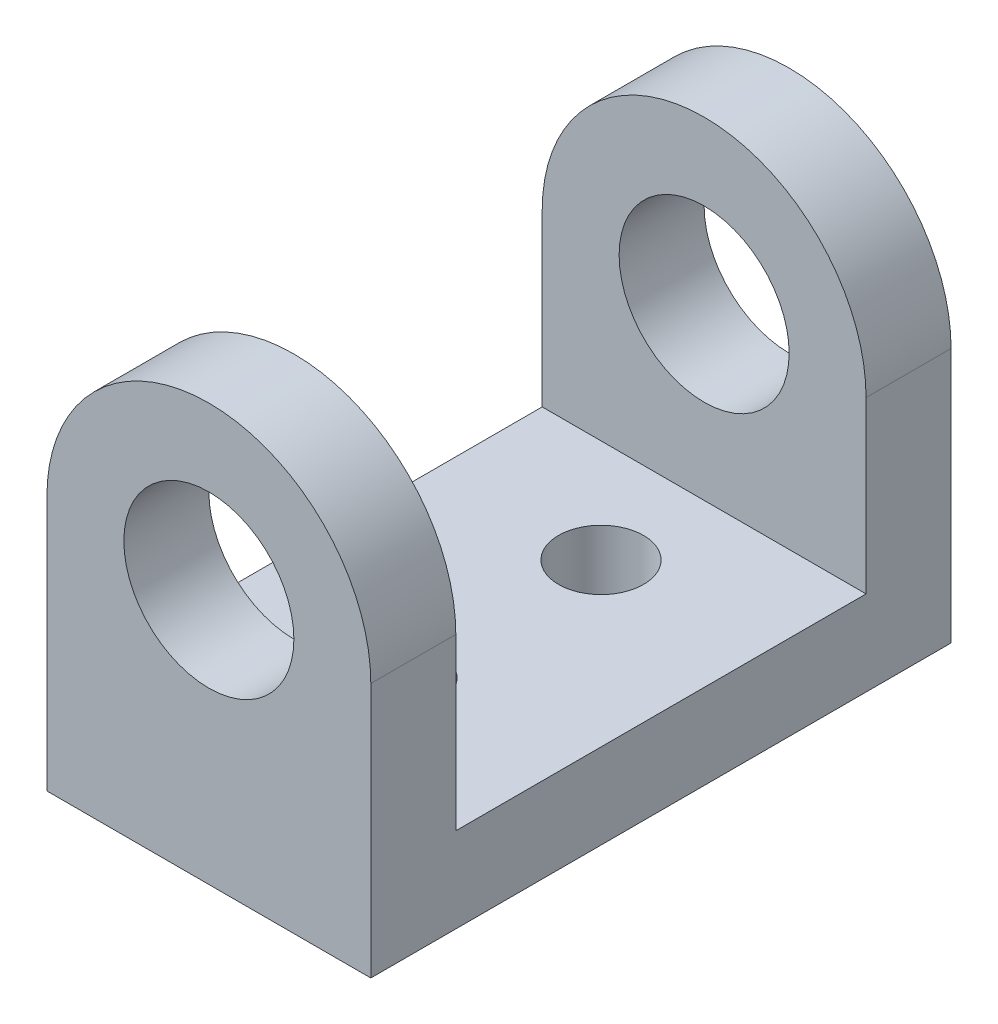
ISO-10303-21;
HEADER;
FILE_DESCRIPTION(('STEP AP214'),'2;1');
FILE_NAME('part.step','',(''),(''),'','','');
FILE_SCHEMA(('AUTOMOTIVE_DESIGN { 1 0 10303 214 1 1 1 1 }'));
ENDSEC;
DATA;
#1=APPLICATION_CONTEXT('core data for automotive mechanical design processes');
#2=APPLICATION_PROTOCOL_DEFINITION('international standard','automotive_design',2000,#1);
#3=PRODUCT_CONTEXT('',#1,'mechanical');
#4=PRODUCT('Part','Part','',(#3));
#5=PRODUCT_RELATED_PRODUCT_CATEGORY('part','',(#4));
#6=PRODUCT_DEFINITION_FORMATION('','',#4);
#7=PRODUCT_DEFINITION_CONTEXT('part definition',#1,'design');
#8=PRODUCT_DEFINITION('design','',#6,#7);
#9=PRODUCT_DEFINITION_SHAPE('','',#8);
#10=(LENGTH_UNIT() NAMED_UNIT(*) SI_UNIT(.MILLI.,.METRE.));
#11=(NAMED_UNIT(*) PLANE_ANGLE_UNIT() SI_UNIT($,.RADIAN.));
#12=(NAMED_UNIT(*) SI_UNIT($,.STERADIAN.) SOLID_ANGLE_UNIT());
#13=UNCERTAINTY_MEASURE_WITH_UNIT(LENGTH_MEASURE(1.E-05),#10,'distance_accuracy_value','');
#14=(GEOMETRIC_REPRESENTATION_CONTEXT(3) GLOBAL_UNCERTAINTY_ASSIGNED_CONTEXT((#13)) GLOBAL_UNIT_ASSIGNED_CONTEXT((#10,
#11,#12)) REPRESENTATION_CONTEXT('',''));
#15=CARTESIAN_POINT('',(0.,0.,0.));
#16=DIRECTION('',(0.,0.,1.));
#17=DIRECTION('',(1.,0.,0.));
#18=AXIS2_PLACEMENT_3D('',#15,#16,#17);
#19=CARTESIAN_POINT('',(0.,0.,34.13));
#20=DIRECTION('',(0.,0.,-1.));
#21=DIRECTION('',(-1.,0.,0.));
#22=AXIS2_PLACEMENT_3D('',#19,#20,#21);
#23=CYLINDRICAL_SURFACE('',#22,9.525);
#24=DIRECTION('',(0.,0.,-1.));
#25=VECTOR('',#24,1.);
#26=CARTESIAN_POINT('',(9.525,0.,34.13));
#27=LINE('',#26,#25);
#28=CARTESIAN_POINT('',(9.525,0.,34.13));
#29=VERTEX_POINT('',#28);
#30=CARTESIAN_POINT('',(9.525,0.,29.13));
#31=VERTEX_POINT('',#30);
#32=EDGE_CURVE('E198',#29,#31,#27,.T.);
#33=ORIENTED_EDGE('',*,*,#32,.T.);
#34=CARTESIAN_POINT('',(0.,0.,29.13));
#35=DIRECTION('',(0.,0.,1.));
#36=DIRECTION('',(0.,-1.,0.));
#37=AXIS2_PLACEMENT_3D('',#34,#35,#36);
#38=CIRCLE('',#37,9.525);
#39=CARTESIAN_POINT('',(-9.525,0.,29.13));
#40=VERTEX_POINT('',#39);
#41=EDGE_CURVE('E165',#31,#40,#38,.T.);
#42=ORIENTED_EDGE('',*,*,#41,.T.);
#43=DIRECTION('',(0.,0.,-1.));
#44=VECTOR('',#43,1.);
#45=CARTESIAN_POINT('',(-9.525,0.,34.13));
#46=LINE('',#45,#44);
#47=CARTESIAN_POINT('',(-9.525,0.,34.13));
#48=VERTEX_POINT('',#47);
#49=EDGE_CURVE('E52',#48,#40,#46,.T.);
#50=ORIENTED_EDGE('',*,*,#49,.F.);
#51=CARTESIAN_POINT('',(0.,0.,34.13));
#52=DIRECTION('',(0.,0.,1.));
#53=DIRECTION('',(1.,0.,0.));
#54=AXIS2_PLACEMENT_3D('',#51,#52,#53);
#55=CIRCLE('',#54,9.525);
#56=EDGE_CURVE('E173',#29,#48,#55,.T.);
#57=ORIENTED_EDGE('',*,*,#56,.F.);
#58=EDGE_LOOP('',(#33,#42,#50,#57));
#59=FACE_BOUND('',#58,.T.);
#60=ADVANCED_FACE('F43',(#59),#23,.T.);
#61=CARTESIAN_POINT('',(0.,0.,34.13));
#62=DIRECTION('',(0.,0.,-1.));
#63=DIRECTION('',(-1.,0.,0.));
#64=AXIS2_PLACEMENT_3D('',#61,#62,#63);
#65=CYLINDRICAL_SURFACE('',#64,5.);
#66=CARTESIAN_POINT('',(0.,0.,29.13));
#67=DIRECTION('',(0.,0.,1.));
#68=DIRECTION('',(0.,-1.,0.));
#69=AXIS2_PLACEMENT_3D('',#66,#67,#68);
#70=CIRCLE('',#69,5.);
#71=CARTESIAN_POINT('',(0.,-5.,29.13));
#72=VERTEX_POINT('',#71);
#73=EDGE_CURVE('E161',#72,#72,#70,.T.);
#74=ORIENTED_EDGE('',*,*,#73,.F.);
#75=EDGE_LOOP('',(#74));
#76=FACE_BOUND('',#75,.T.);
#77=CARTESIAN_POINT('',(0.,0.,34.13));
#78=DIRECTION('',(0.,0.,1.));
#79=DIRECTION('',(1.,0.,0.));
#80=AXIS2_PLACEMENT_3D('',#77,#78,#79);
#81=CIRCLE('',#80,5.);
#82=CARTESIAN_POINT('',(5.,0.,34.13));
#83=VERTEX_POINT('',#82);
#84=EDGE_CURVE('E169',#83,#83,#81,.T.);
#85=ORIENTED_EDGE('',*,*,#84,.T.);
#86=EDGE_LOOP('',(#85));
#87=FACE_BOUND('',#86,.T.);
#88=ADVANCED_FACE('F221',(#76,#87),#65,.F.);
#89=CARTESIAN_POINT('',(0.,0.,5.));
#90=DIRECTION('',(0.,0.,-1.));
#91=DIRECTION('',(0.,1.,0.));
#92=AXIS2_PLACEMENT_3D('',#89,#90,#91);
#93=CIRCLE('',#92,9.525);
#94=CARTESIAN_POINT('',(-9.525,0.,5.));
#95=VERTEX_POINT('',#94);
#96=CARTESIAN_POINT('',(9.525,0.,5.));
#97=VERTEX_POINT('',#96);
#98=EDGE_CURVE('E158',#95,#97,#93,.T.);
#99=ORIENTED_EDGE('',*,*,#98,.T.);
#100=CARTESIAN_POINT('',(9.525,0.,0.));
#101=VERTEX_POINT('',#100);
#102=EDGE_CURVE('E90',#97,#101,#27,.T.);
#103=ORIENTED_EDGE('',*,*,#102,.T.);
#104=CARTESIAN_POINT('',(0.,0.,0.));
#105=DIRECTION('',(0.,0.,1.));
#106=DIRECTION('',(1.,0.,0.));
#107=AXIS2_PLACEMENT_3D('',#104,#105,#106);
#108=CIRCLE('',#107,9.525);
#109=CARTESIAN_POINT('',(-9.525,0.,0.));
#110=VERTEX_POINT('',#109);
#111=EDGE_CURVE('E187',#101,#110,#108,.T.);
#112=ORIENTED_EDGE('',*,*,#111,.T.);
#113=EDGE_CURVE('E209',#95,#110,#46,.T.);
#114=ORIENTED_EDGE('',*,*,#113,.F.);
#115=EDGE_LOOP('',(#99,#103,#112,#114));
#116=FACE_BOUND('',#115,.T.);
#117=ADVANCED_FACE('F219',(#116),#23,.T.);
#118=CARTESIAN_POINT('',(-9.525,0.,34.13));
#119=DIRECTION('',(1.,0.,0.));
#120=DIRECTION('',(0.,1.,0.));
#121=AXIS2_PLACEMENT_3D('',#118,#119,#120);
#122=PLANE('',#121);
#123=ORIENTED_EDGE('',*,*,#49,.T.);
#124=DIRECTION('',(0.,-1.,0.));
#125=VECTOR('',#124,1.);
#126=CARTESIAN_POINT('',(-9.525,9.525,29.13));
#127=LINE('',#126,#125);
#128=CARTESIAN_POINT('',(-9.52500000000001,-10.,29.13));
#129=VERTEX_POINT('',#128);
#130=EDGE_CURVE('E121',#40,#129,#127,.T.);
#131=ORIENTED_EDGE('',*,*,#130,.T.);
#132=DIRECTION('',(0.,0.,-1.));
#133=VECTOR('',#132,1.);
#134=CARTESIAN_POINT('',(-9.52500000000001,-10.,29.13));
#135=LINE('',#134,#133);
#136=CARTESIAN_POINT('',(-9.52500000000001,-10.,5.));
#137=VERTEX_POINT('',#136);
#138=EDGE_CURVE('E128',#129,#137,#135,.T.);
#139=ORIENTED_EDGE('',*,*,#138,.T.);
#140=DIRECTION('',(0.,1.,0.));
#141=VECTOR('',#140,1.);
#142=CARTESIAN_POINT('',(-9.525,9.525,5.));
#143=LINE('',#142,#141);
#144=EDGE_CURVE('E125',#137,#95,#143,.T.);
#145=ORIENTED_EDGE('',*,*,#144,.T.);
#146=ORIENTED_EDGE('',*,*,#113,.T.);
#147=DIRECTION('',(0.,-1.,0.));
#148=VECTOR('',#147,1.);
#149=CARTESIAN_POINT('',(-9.525,0.,0.));
#150=LINE('',#149,#148);
#151=CARTESIAN_POINT('',(-9.525,-15.,0.));
#152=VERTEX_POINT('',#151);
#153=EDGE_CURVE('E190',#110,#152,#150,.T.);
#154=ORIENTED_EDGE('',*,*,#153,.T.);
#155=DIRECTION('',(0.,0.,-1.));
#156=VECTOR('',#155,1.);
#157=CARTESIAN_POINT('',(-9.525,-15.,34.13));
#158=LINE('',#157,#156);
#159=CARTESIAN_POINT('',(-9.525,-15.,34.13));
#160=VERTEX_POINT('',#159);
#161=EDGE_CURVE('E206',#160,#152,#158,.T.);
#162=ORIENTED_EDGE('',*,*,#161,.F.);
#163=DIRECTION('',(0.,-1.,0.));
#164=VECTOR('',#163,1.);
#165=CARTESIAN_POINT('',(-9.525,0.,34.13));
#166=LINE('',#165,#164);
#167=EDGE_CURVE('E98',#48,#160,#166,.T.);
#168=ORIENTED_EDGE('',*,*,#167,.F.);
#169=EDGE_LOOP('',(#123,#131,#139,#145,#146,#154,#162,#168));
#170=FACE_BOUND('',#169,.T.);
#171=ADVANCED_FACE('F134',(#170),#122,.F.);
#172=CARTESIAN_POINT('',(0.,-15.,34.13));
#173=DIRECTION('',(0.,1.,0.));
#174=DIRECTION('',(0.,0.,1.));
#175=AXIS2_PLACEMENT_3D('',#172,#173,#174);
#176=PLANE('',#175);
#177=CARTESIAN_POINT('',(0.,-15.,11.065));
#178=DIRECTION('',(0.,1.,0.));
#179=DIRECTION('',(-1.,0.,0.));
#180=AXIS2_PLACEMENT_3D('',#177,#178,#179);
#181=CIRCLE('',#180,2.5);
#182=CARTESIAN_POINT('',(-2.5,-15.,11.065));
#183=VERTEX_POINT('',#182);
#184=EDGE_CURVE('E150',#183,#183,#181,.T.);
#185=ORIENTED_EDGE('',*,*,#184,.T.);
#186=EDGE_LOOP('',(#185));
#187=FACE_BOUND('',#186,.T.);
#188=CARTESIAN_POINT('',(0.,-15.,23.065));
#189=DIRECTION('',(0.,1.,0.));
#190=DIRECTION('',(1.,0.,0.));
#191=AXIS2_PLACEMENT_3D('',#188,#189,#190);
#192=CIRCLE('',#191,2.5);
#193=CARTESIAN_POINT('',(2.5,-15.,23.065));
#194=VERTEX_POINT('',#193);
#195=EDGE_CURVE('E144',#194,#194,#192,.T.);
#196=ORIENTED_EDGE('',*,*,#195,.T.);
#197=EDGE_LOOP('',(#196));
#198=FACE_BOUND('',#197,.T.);
#199=DIRECTION('',(1.,0.,0.));
#200=VECTOR('',#199,1.);
#201=CARTESIAN_POINT('',(0.,-15.,0.));
#202=LINE('',#201,#200);
#203=CARTESIAN_POINT('',(9.525,-15.,0.));
#204=VERTEX_POINT('',#203);
#205=EDGE_CURVE('E193',#152,#204,#202,.T.);
#206=ORIENTED_EDGE('',*,*,#205,.T.);
#207=DIRECTION('',(0.,0.,-1.));
#208=VECTOR('',#207,1.);
#209=CARTESIAN_POINT('',(9.525,-15.,34.13));
#210=LINE('',#209,#208);
#211=CARTESIAN_POINT('',(9.525,-15.,34.13));
#212=VERTEX_POINT('',#211);
#213=EDGE_CURVE('E202',#212,#204,#210,.T.);
#214=ORIENTED_EDGE('',*,*,#213,.F.);
#215=DIRECTION('',(1.,0.,0.));
#216=VECTOR('',#215,1.);
#217=CARTESIAN_POINT('',(0.,-15.,34.13));
#218=LINE('',#217,#216);
#219=EDGE_CURVE('E179',#160,#212,#218,.T.);
#220=ORIENTED_EDGE('',*,*,#219,.F.);
#221=ORIENTED_EDGE('',*,*,#161,.T.);
#222=EDGE_LOOP('',(#206,#214,#220,#221));
#223=FACE_BOUND('',#222,.T.);
#224=ADVANCED_FACE('F226',(#187,#198,#223),#176,.F.);
#225=CARTESIAN_POINT('',(0.,0.,5.));
#226=DIRECTION('',(0.,0.,-1.));
#227=DIRECTION('',(0.,1.,0.));
#228=AXIS2_PLACEMENT_3D('',#225,#226,#227);
#229=CIRCLE('',#228,5.);
#230=CARTESIAN_POINT('',(0.,5.,5.));
#231=VERTEX_POINT('',#230);
#232=EDGE_CURVE('E153',#231,#231,#229,.T.);
#233=ORIENTED_EDGE('',*,*,#232,.F.);
#234=EDGE_LOOP('',(#233));
#235=FACE_BOUND('',#234,.T.);
#236=CARTESIAN_POINT('',(0.,0.,0.));
#237=DIRECTION('',(0.,0.,1.));
#238=DIRECTION('',(1.,0.,0.));
#239=AXIS2_PLACEMENT_3D('',#236,#237,#238);
#240=CIRCLE('',#239,5.);
#241=CARTESIAN_POINT('',(5.,0.,0.));
#242=VERTEX_POINT('',#241);
#243=EDGE_CURVE('E168',#242,#242,#240,.T.);
#244=ORIENTED_EDGE('',*,*,#243,.F.);
#245=EDGE_LOOP('',(#244));
#246=FACE_BOUND('',#245,.T.);
#247=ADVANCED_FACE('F45',(#235,#246),#65,.F.);
#248=CARTESIAN_POINT('',(9.525,0.,34.13));
#249=DIRECTION('',(-1.,0.,0.));
#250=DIRECTION('',(0.,-1.,0.));
#251=AXIS2_PLACEMENT_3D('',#248,#249,#250);
#252=PLANE('',#251);
#253=DIRECTION('',(0.,0.,-1.));
#254=VECTOR('',#253,1.);
#255=CARTESIAN_POINT('',(9.525,-10.,29.13));
#256=LINE('',#255,#254);
#257=CARTESIAN_POINT('',(9.525,-10.,29.13));
#258=VERTEX_POINT('',#257);
#259=CARTESIAN_POINT('',(9.525,-10.,5.));
#260=VERTEX_POINT('',#259);
#261=EDGE_CURVE('E141',#258,#260,#256,.T.);
#262=ORIENTED_EDGE('',*,*,#261,.F.);
#263=DIRECTION('',(0.,1.,0.));
#264=VECTOR('',#263,1.);
#265=CARTESIAN_POINT('',(9.525,0.,29.13));
#266=LINE('',#265,#264);
#267=EDGE_CURVE('E11',#258,#31,#266,.T.);
#268=ORIENTED_EDGE('',*,*,#267,.T.);
#269=ORIENTED_EDGE('',*,*,#32,.F.);
#270=DIRECTION('',(0.,1.,0.));
#271=VECTOR('',#270,1.);
#272=CARTESIAN_POINT('',(9.525,0.,34.13));
#273=LINE('',#272,#271);
#274=EDGE_CURVE('E68',#212,#29,#273,.T.);
#275=ORIENTED_EDGE('',*,*,#274,.F.);
#276=ORIENTED_EDGE('',*,*,#213,.T.);
#277=DIRECTION('',(0.,1.,0.));
#278=VECTOR('',#277,1.);
#279=CARTESIAN_POINT('',(9.525,0.,0.));
#280=LINE('',#279,#278);
#281=EDGE_CURVE('E174',#204,#101,#280,.T.);
#282=ORIENTED_EDGE('',*,*,#281,.T.);
#283=ORIENTED_EDGE('',*,*,#102,.F.);
#284=DIRECTION('',(0.,1.,0.));
#285=VECTOR('',#284,1.);
#286=CARTESIAN_POINT('',(9.525,9.52499999999999,5.));
#287=LINE('',#286,#285);
#288=EDGE_CURVE('E137',#260,#97,#287,.T.);
#289=ORIENTED_EDGE('',*,*,#288,.F.);
#290=EDGE_LOOP('',(#262,#268,#269,#275,#276,#282,#283,#289));
#291=FACE_BOUND('',#290,.T.);
#292=ADVANCED_FACE('F235',(#291),#252,.F.);
#293=CARTESIAN_POINT('',(0.,0.,34.13));
#294=DIRECTION('',(0.,0.,1.));
#295=DIRECTION('',(1.,0.,0.));
#296=AXIS2_PLACEMENT_3D('',#293,#294,#295);
#297=PLANE('',#296);
#298=ORIENTED_EDGE('',*,*,#84,.F.);
#299=EDGE_LOOP('',(#298));
#300=FACE_BOUND('',#299,.T.);
#301=ORIENTED_EDGE('',*,*,#56,.T.);
#302=ORIENTED_EDGE('',*,*,#167,.T.);
#303=ORIENTED_EDGE('',*,*,#219,.T.);
#304=ORIENTED_EDGE('',*,*,#274,.T.);
#305=EDGE_LOOP('',(#301,#302,#303,#304));
#306=FACE_BOUND('',#305,.T.);
#307=ADVANCED_FACE('F254',(#300,#306),#297,.T.);
#308=CARTESIAN_POINT('',(0.,0.,0.));
#309=DIRECTION('',(0.,0.,1.));
#310=DIRECTION('',(1.,0.,0.));
#311=AXIS2_PLACEMENT_3D('',#308,#309,#310);
#312=PLANE('',#311);
#313=ORIENTED_EDGE('',*,*,#243,.T.);
#314=EDGE_LOOP('',(#313));
#315=FACE_BOUND('',#314,.T.);
#316=ORIENTED_EDGE('',*,*,#111,.F.);
#317=ORIENTED_EDGE('',*,*,#281,.F.);
#318=ORIENTED_EDGE('',*,*,#205,.F.);
#319=ORIENTED_EDGE('',*,*,#153,.F.);
#320=EDGE_LOOP('',(#316,#317,#318,#319));
#321=FACE_BOUND('',#320,.T.);
#322=ADVANCED_FACE('F217',(#315,#321),#312,.F.);
#323=CARTESIAN_POINT('',(-9.525,9.525,29.13));
#324=DIRECTION('',(0.,0.,1.));
#325=DIRECTION('',(0.,-1.,0.));
#326=AXIS2_PLACEMENT_3D('',#323,#324,#325);
#327=PLANE('',#326);
#328=ORIENTED_EDGE('',*,*,#73,.T.);
#329=EDGE_LOOP('',(#328));
#330=FACE_BOUND('',#329,.T.);
#331=ORIENTED_EDGE('',*,*,#267,.F.);
#332=DIRECTION('',(1.,0.,0.));
#333=VECTOR('',#332,1.);
#334=CARTESIAN_POINT('',(-9.52500000000001,-10.,29.13));
#335=LINE('',#334,#333);
#336=EDGE_CURVE('E59',#129,#258,#335,.T.);
#337=ORIENTED_EDGE('',*,*,#336,.F.);
#338=ORIENTED_EDGE('',*,*,#130,.F.);
#339=ORIENTED_EDGE('',*,*,#41,.F.);
#340=EDGE_LOOP('',(#331,#337,#338,#339));
#341=FACE_BOUND('',#340,.T.);
#342=ADVANCED_FACE('F119',(#330,#341),#327,.F.);
#343=CARTESIAN_POINT('',(-9.525,9.525,5.));
#344=DIRECTION('',(0.,0.,-1.));
#345=DIRECTION('',(0.,1.,0.));
#346=AXIS2_PLACEMENT_3D('',#343,#344,#345);
#347=PLANE('',#346);
#348=ORIENTED_EDGE('',*,*,#232,.T.);
#349=EDGE_LOOP('',(#348));
#350=FACE_BOUND('',#349,.T.);
#351=ORIENTED_EDGE('',*,*,#98,.F.);
#352=ORIENTED_EDGE('',*,*,#144,.F.);
#353=DIRECTION('',(1.,0.,0.));
#354=VECTOR('',#353,1.);
#355=CARTESIAN_POINT('',(-9.52500000000001,-10.,5.));
#356=LINE('',#355,#354);
#357=EDGE_CURVE('E124',#137,#260,#356,.T.);
#358=ORIENTED_EDGE('',*,*,#357,.T.);
#359=ORIENTED_EDGE('',*,*,#288,.T.);
#360=EDGE_LOOP('',(#351,#352,#358,#359));
#361=FACE_BOUND('',#360,.T.);
#362=ADVANCED_FACE('F238',(#350,#361),#347,.F.);
#363=CARTESIAN_POINT('',(-9.52500000000001,-10.,29.13));
#364=DIRECTION('',(0.,-1.,0.));
#365=DIRECTION('',(1.,0.,0.));
#366=AXIS2_PLACEMENT_3D('',#363,#364,#365);
#367=PLANE('',#366);
#368=CARTESIAN_POINT('',(0.,-10.,11.065));
#369=DIRECTION('',(0.,1.,0.));
#370=DIRECTION('',(-1.,0.,0.));
#371=AXIS2_PLACEMENT_3D('',#368,#369,#370);
#372=CIRCLE('',#371,2.5);
#373=CARTESIAN_POINT('',(-2.5,-10.,11.065));
#374=VERTEX_POINT('',#373);
#375=EDGE_CURVE('E282',#374,#374,#372,.T.);
#376=ORIENTED_EDGE('',*,*,#375,.F.);
#377=EDGE_LOOP('',(#376));
#378=FACE_BOUND('',#377,.T.);
#379=CARTESIAN_POINT('',(0.,-10.,23.065));
#380=DIRECTION('',(0.,1.,0.));
#381=DIRECTION('',(1.,0.,0.));
#382=AXIS2_PLACEMENT_3D('',#379,#380,#381);
#383=CIRCLE('',#382,2.5);
#384=CARTESIAN_POINT('',(2.5,-10.,23.065));
#385=VERTEX_POINT('',#384);
#386=EDGE_CURVE('E279',#385,#385,#383,.T.);
#387=ORIENTED_EDGE('',*,*,#386,.F.);
#388=EDGE_LOOP('',(#387));
#389=FACE_BOUND('',#388,.T.);
#390=ORIENTED_EDGE('',*,*,#261,.T.);
#391=ORIENTED_EDGE('',*,*,#357,.F.);
#392=ORIENTED_EDGE('',*,*,#138,.F.);
#393=ORIENTED_EDGE('',*,*,#336,.T.);
#394=EDGE_LOOP('',(#390,#391,#392,#393));
#395=FACE_BOUND('',#394,.T.);
#396=ADVANCED_FACE('F129',(#378,#389,#395),#367,.F.);
#397=CARTESIAN_POINT('',(0.,-15.,23.065));
#398=DIRECTION('',(0.,1.,0.));
#399=DIRECTION('',(-1.,0.,0.));
#400=AXIS2_PLACEMENT_3D('',#397,#398,#399);
#401=CYLINDRICAL_SURFACE('',#400,2.5);
#402=ORIENTED_EDGE('',*,*,#195,.F.);
#403=EDGE_LOOP('',(#402));
#404=FACE_BOUND('',#403,.T.);
#405=ORIENTED_EDGE('',*,*,#386,.T.);
#406=EDGE_LOOP('',(#405));
#407=FACE_BOUND('',#406,.T.);
#408=ADVANCED_FACE('F246',(#404,#407),#401,.F.);
#409=CARTESIAN_POINT('',(0.,-15.,11.065));
#410=DIRECTION('',(0.,1.,0.));
#411=DIRECTION('',(-1.,0.,0.));
#412=AXIS2_PLACEMENT_3D('',#409,#410,#411);
#413=CYLINDRICAL_SURFACE('',#412,2.5);
#414=ORIENTED_EDGE('',*,*,#184,.F.);
#415=EDGE_LOOP('',(#414));
#416=FACE_BOUND('',#415,.T.);
#417=ORIENTED_EDGE('',*,*,#375,.T.);
#418=EDGE_LOOP('',(#417));
#419=FACE_BOUND('',#418,.T.);
#420=ADVANCED_FACE('F292',(#416,#419),#413,.F.);
#421=CLOSED_SHELL('',(#60,#88,#117,#171,#224,#247,#292,#307,#322,#342,#362,#396,#408,#420));
#422=MANIFOLD_SOLID_BREP('B2',#421);
#423=ADVANCED_BREP_SHAPE_REPRESENTATION('',(#18,#422),#14);
#424=SHAPE_DEFINITION_REPRESENTATION(#9,#423);
ENDSEC;
END-ISO-10303-21;
